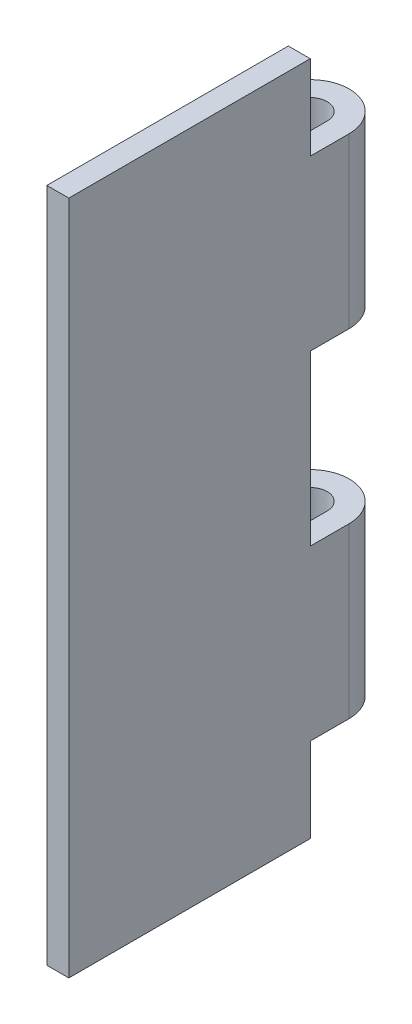
ISO-10303-21;
HEADER;
FILE_DESCRIPTION(('STEP AP214'),'2;1');
FILE_NAME('part.step','',(''),(''),'','','');
FILE_SCHEMA(('AUTOMOTIVE_DESIGN { 1 0 10303 214 1 1 1 1 }'));
ENDSEC;
DATA;
#1=APPLICATION_CONTEXT('core data for automotive mechanical design processes');
#2=APPLICATION_PROTOCOL_DEFINITION('international standard','automotive_design',2000,#1);
#3=PRODUCT_CONTEXT('',#1,'mechanical');
#4=PRODUCT('Part','Part','',(#3));
#5=PRODUCT_RELATED_PRODUCT_CATEGORY('part','',(#4));
#6=PRODUCT_DEFINITION_FORMATION('','',#4);
#7=PRODUCT_DEFINITION_CONTEXT('part definition',#1,'design');
#8=PRODUCT_DEFINITION('design','',#6,#7);
#9=PRODUCT_DEFINITION_SHAPE('','',#8);
#10=(LENGTH_UNIT() NAMED_UNIT(*) SI_UNIT(.MILLI.,.METRE.));
#11=(NAMED_UNIT(*) PLANE_ANGLE_UNIT() SI_UNIT($,.RADIAN.));
#12=(NAMED_UNIT(*) SI_UNIT($,.STERADIAN.) SOLID_ANGLE_UNIT());
#13=UNCERTAINTY_MEASURE_WITH_UNIT(LENGTH_MEASURE(1.E-05),#10,'distance_accuracy_value','');
#14=(GEOMETRIC_REPRESENTATION_CONTEXT(3) GLOBAL_UNCERTAINTY_ASSIGNED_CONTEXT((#13)) GLOBAL_UNIT_ASSIGNED_CONTEXT((#10,
#11,#12)) REPRESENTATION_CONTEXT('',''));
#15=CARTESIAN_POINT('',(0.,0.,0.));
#16=DIRECTION('',(0.,0.,1.));
#17=DIRECTION('',(1.,0.,0.));
#18=AXIS2_PLACEMENT_3D('',#15,#16,#17);
#19=CARTESIAN_POINT('',(-382.905,25.3999999999999,302.966610048912));
#20=DIRECTION('',(-0.937559071862946,0.,0.347826086956531));
#21=DIRECTION('',(0.347826086956531,0.,0.937559071862946));
#22=AXIS2_PLACEMENT_3D('',#19,#20,#21);
#23=PLANE('',#22);
#24=DIRECTION('',(0.,-1.,0.));
#25=VECTOR('',#24,1.);
#26=CARTESIAN_POINT('',(-383.479260869565,25.3999999999999,301.418700021266));
#27=LINE('',#26,#25);
#28=CARTESIAN_POINT('',(-383.479260869565,-19.0500000000001,301.418700021266));
#29=VERTEX_POINT('',#28);
#30=CARTESIAN_POINT('',(-383.479260869565,-6.35000000000014,301.418700021266));
#31=VERTEX_POINT('',#30);
#32=EDGE_CURVE('E237',#29,#31,#27,.F.);
#33=ORIENTED_EDGE('',*,*,#32,.T.);
#34=DIRECTION('',(0.347826086956531,0.,0.937559071862946));
#35=VECTOR('',#34,1.);
#36=CARTESIAN_POINT('',(-382.905,-6.35000000000016,302.966610048912));
#37=LINE('',#36,#35);
#38=CARTESIAN_POINT('',(-382.905,-6.35000000000013,302.966610048912));
#39=VERTEX_POINT('',#38);
#40=EDGE_CURVE('E242',#39,#31,#37,.F.);
#41=ORIENTED_EDGE('',*,*,#40,.F.);
#42=DIRECTION('',(0.,-1.,0.));
#43=VECTOR('',#42,1.);
#44=CARTESIAN_POINT('',(-382.905,25.3999999999999,302.966610048912));
#45=LINE('',#44,#43);
#46=CARTESIAN_POINT('',(-382.905,-19.0500000000001,302.966610048912));
#47=VERTEX_POINT('',#46);
#48=EDGE_CURVE('E125',#47,#39,#45,.F.);
#49=ORIENTED_EDGE('',*,*,#48,.F.);
#50=DIRECTION('',(-0.347826086956531,0.,-0.937559071862946));
#51=VECTOR('',#50,1.);
#52=CARTESIAN_POINT('',(-382.905,-19.0500000000001,302.966610048912));
#53=LINE('',#52,#51);
#54=EDGE_CURVE('E138',#47,#29,#53,.T.);
#55=ORIENTED_EDGE('',*,*,#54,.T.);
#56=EDGE_LOOP('',(#33,#41,#49,#55));
#57=FACE_BOUND('',#56,.T.);
#58=ADVANCED_FACE('F17',(#57),#23,.F.);
#59=CARTESIAN_POINT('',(-383.921,25.3999999999999,300.228));
#60=DIRECTION('',(0.,-1.,0.));
#61=DIRECTION('',(0.,0.,-1.));
#62=AXIS2_PLACEMENT_3D('',#59,#60,#61);
#63=CYLINDRICAL_SURFACE('',#62,2.92099999999998);
#64=CARTESIAN_POINT('',(-383.921,-6.35000000000009,300.228));
#65=DIRECTION('',(0.,-1.,0.));
#66=DIRECTION('',(0.,0.,-1.));
#67=AXIS2_PLACEMENT_3D('',#64,#65,#66);
#68=CIRCLE('',#67,2.92099999999998);
#69=CARTESIAN_POINT('',(-381.,-6.35000000000011,300.228));
#70=VERTEX_POINT('',#69);
#71=EDGE_CURVE('E144',#39,#70,#68,.T.);
#72=ORIENTED_EDGE('',*,*,#71,.T.);
#73=DIRECTION('',(0.,1.,0.));
#74=VECTOR('',#73,1.);
#75=CARTESIAN_POINT('',(-381.,25.3999999999999,300.228));
#76=LINE('',#75,#74);
#77=CARTESIAN_POINT('',(-381.,-19.0500000000001,300.228));
#78=VERTEX_POINT('',#77);
#79=EDGE_CURVE('E141',#70,#78,#76,.F.);
#80=ORIENTED_EDGE('',*,*,#79,.T.);
#81=CARTESIAN_POINT('',(-383.921,-19.05,300.228));
#82=DIRECTION('',(0.,-1.,0.));
#83=DIRECTION('',(0.,0.,-1.));
#84=AXIS2_PLACEMENT_3D('',#81,#82,#83);
#85=CIRCLE('',#84,2.92099999999998);
#86=EDGE_CURVE('E20',#78,#47,#85,.F.);
#87=ORIENTED_EDGE('',*,*,#86,.T.);
#88=ORIENTED_EDGE('',*,*,#48,.T.);
#89=EDGE_LOOP('',(#72,#80,#87,#88));
#90=FACE_BOUND('',#89,.T.);
#91=ADVANCED_FACE('F142',(#90),#63,.T.);
#92=CARTESIAN_POINT('',(-382.905,25.3999999999999,302.966610048912));
#93=DIRECTION('',(-0.937559071862946,0.,0.347826086956531));
#94=DIRECTION('',(0.347826086956531,0.,0.937559071862946));
#95=AXIS2_PLACEMENT_3D('',#92,#93,#94);
#96=PLANE('',#95);
#97=DIRECTION('',(0.,-1.,0.));
#98=VECTOR('',#97,1.);
#99=CARTESIAN_POINT('',(-382.905,25.3999999999999,302.966610048912));
#100=LINE('',#99,#98);
#101=CARTESIAN_POINT('',(-382.905,6.34999999999991,302.966610048912));
#102=VERTEX_POINT('',#101);
#103=CARTESIAN_POINT('',(-382.905,19.0499999999998,302.966610048912));
#104=VERTEX_POINT('',#103);
#105=EDGE_CURVE('E226',#102,#104,#100,.F.);
#106=ORIENTED_EDGE('',*,*,#105,.F.);
#107=DIRECTION('',(-0.347826086956531,0.,-0.937559071862946));
#108=VECTOR('',#107,1.);
#109=CARTESIAN_POINT('',(-382.905,6.34999999999991,302.966610048912));
#110=LINE('',#109,#108);
#111=CARTESIAN_POINT('',(-383.479260869565,6.34999999999991,301.418700021266));
#112=VERTEX_POINT('',#111);
#113=EDGE_CURVE('E252',#102,#112,#110,.T.);
#114=ORIENTED_EDGE('',*,*,#113,.T.);
#115=DIRECTION('',(0.,-1.,0.));
#116=VECTOR('',#115,1.);
#117=CARTESIAN_POINT('',(-383.479260869565,25.3999999999999,301.418700021266));
#118=LINE('',#117,#116);
#119=CARTESIAN_POINT('',(-383.479260869565,19.0499999999998,301.418700021266));
#120=VERTEX_POINT('',#119);
#121=EDGE_CURVE('E219',#112,#120,#118,.F.);
#122=ORIENTED_EDGE('',*,*,#121,.T.);
#123=DIRECTION('',(0.347826086956531,0.,0.937559071862946));
#124=VECTOR('',#123,1.);
#125=CARTESIAN_POINT('',(-382.905,19.0499999999998,302.966610048912));
#126=LINE('',#125,#124);
#127=EDGE_CURVE('E229',#104,#120,#126,.F.);
#128=ORIENTED_EDGE('',*,*,#127,.F.);
#129=EDGE_LOOP('',(#106,#114,#122,#128));
#130=FACE_BOUND('',#129,.T.);
#131=ADVANCED_FACE('F355',(#130),#96,.F.);
#132=CARTESIAN_POINT('',(-383.921,25.3999999999999,300.228));
#133=DIRECTION('',(0.,-1.,0.));
#134=DIRECTION('',(0.,0.,-1.));
#135=AXIS2_PLACEMENT_3D('',#132,#133,#134);
#136=CYLINDRICAL_SURFACE('',#135,2.92099999999998);
#137=CARTESIAN_POINT('',(-383.921,6.34999999999991,300.228));
#138=DIRECTION('',(0.,-1.,0.));
#139=DIRECTION('',(0.,0.,-1.));
#140=AXIS2_PLACEMENT_3D('',#137,#138,#139);
#141=CIRCLE('',#140,2.92099999999998);
#142=CARTESIAN_POINT('',(-381.,6.34999999999991,300.228));
#143=VERTEX_POINT('',#142);
#144=EDGE_CURVE('E253',#143,#102,#141,.F.);
#145=ORIENTED_EDGE('',*,*,#144,.T.);
#146=ORIENTED_EDGE('',*,*,#105,.T.);
#147=CARTESIAN_POINT('',(-383.921,19.0499999999998,300.228));
#148=DIRECTION('',(0.,-1.,0.));
#149=DIRECTION('',(0.,0.,-1.));
#150=AXIS2_PLACEMENT_3D('',#147,#148,#149);
#151=CIRCLE('',#150,2.92099999999998);
#152=CARTESIAN_POINT('',(-381.,19.0499999999998,300.228));
#153=VERTEX_POINT('',#152);
#154=EDGE_CURVE('E222',#104,#153,#151,.T.);
#155=ORIENTED_EDGE('',*,*,#154,.T.);
#156=DIRECTION('',(0.,1.,0.));
#157=VECTOR('',#156,1.);
#158=CARTESIAN_POINT('',(-381.,25.3999999999999,300.228));
#159=LINE('',#158,#157);
#160=EDGE_CURVE('E147',#153,#143,#159,.F.);
#161=ORIENTED_EDGE('',*,*,#160,.T.);
#162=EDGE_LOOP('',(#145,#146,#155,#161));
#163=FACE_BOUND('',#162,.T.);
#164=ADVANCED_FACE('F394',(#163),#136,.T.);
#165=CARTESIAN_POINT('',(-381.,25.3999999999999,321.31));
#166=DIRECTION('',(-1.,0.,0.));
#167=DIRECTION('',(0.,0.,1.));
#168=AXIS2_PLACEMENT_3D('',#165,#166,#167);
#169=PLANE('',#168);
#170=DIRECTION('',(0.,0.,1.));
#171=VECTOR('',#170,1.);
#172=CARTESIAN_POINT('',(-381.,-19.0500000000001,297.307));
#173=LINE('',#172,#171);
#174=CARTESIAN_POINT('',(-381.,-19.0500000000001,303.149));
#175=VERTEX_POINT('',#174);
#176=EDGE_CURVE('E135',#175,#78,#173,.F.);
#177=ORIENTED_EDGE('',*,*,#176,.T.);
#178=ORIENTED_EDGE('',*,*,#79,.F.);
#179=DIRECTION('',(0.,0.,-1.));
#180=VECTOR('',#179,1.);
#181=CARTESIAN_POINT('',(-381.,-6.35000000000013,297.307));
#182=LINE('',#181,#180);
#183=CARTESIAN_POINT('',(-381.,-6.35000000000013,303.149));
#184=VERTEX_POINT('',#183);
#185=EDGE_CURVE('E260',#70,#184,#182,.F.);
#186=ORIENTED_EDGE('',*,*,#185,.T.);
#187=DIRECTION('',(0.,1.,0.));
#188=VECTOR('',#187,1.);
#189=CARTESIAN_POINT('',(-381.,6.34999999999991,303.149));
#190=LINE('',#189,#188);
#191=CARTESIAN_POINT('',(-381.,6.34999999999991,303.149));
#192=VERTEX_POINT('',#191);
#193=EDGE_CURVE('E231',#184,#192,#190,.T.);
#194=ORIENTED_EDGE('',*,*,#193,.T.);
#195=DIRECTION('',(0.,0.,1.));
#196=VECTOR('',#195,1.);
#197=CARTESIAN_POINT('',(-381.,6.34999999999991,297.307));
#198=LINE('',#197,#196);
#199=EDGE_CURVE('E256',#192,#143,#198,.F.);
#200=ORIENTED_EDGE('',*,*,#199,.T.);
#201=ORIENTED_EDGE('',*,*,#160,.F.);
#202=DIRECTION('',(0.,0.,-1.));
#203=VECTOR('',#202,1.);
#204=CARTESIAN_POINT('',(-381.,19.0499999999998,297.307));
#205=LINE('',#204,#203);
#206=CARTESIAN_POINT('',(-381.,19.0499999999998,303.149));
#207=VERTEX_POINT('',#206);
#208=EDGE_CURVE('E247',#153,#207,#205,.F.);
#209=ORIENTED_EDGE('',*,*,#208,.T.);
#210=DIRECTION('',(0.,1.,0.));
#211=VECTOR('',#210,1.);
#212=CARTESIAN_POINT('',(-381.,31.7499999999999,303.149));
#213=LINE('',#212,#211);
#214=CARTESIAN_POINT('',(-381.,25.3999999999999,303.149));
#215=VERTEX_POINT('',#214);
#216=EDGE_CURVE('E202',#207,#215,#213,.T.);
#217=ORIENTED_EDGE('',*,*,#216,.T.);
#218=DIRECTION('',(0.,0.,1.));
#219=VECTOR('',#218,1.);
#220=CARTESIAN_POINT('',(-381.,25.3999999999999,300.228));
#221=LINE('',#220,#219);
#222=CARTESIAN_POINT('',(-381.,25.3999999999999,321.31));
#223=VERTEX_POINT('',#222);
#224=EDGE_CURVE('E200',#223,#215,#221,.F.);
#225=ORIENTED_EDGE('',*,*,#224,.F.);
#226=DIRECTION('',(0.,1.,0.));
#227=VECTOR('',#226,1.);
#228=CARTESIAN_POINT('',(-381.,25.3999999999999,321.31));
#229=LINE('',#228,#227);
#230=CARTESIAN_POINT('',(-381.,-25.4000000000001,321.31));
#231=VERTEX_POINT('',#230);
#232=EDGE_CURVE('E183',#223,#231,#229,.F.);
#233=ORIENTED_EDGE('',*,*,#232,.T.);
#234=DIRECTION('',(0.,0.,1.));
#235=VECTOR('',#234,1.);
#236=CARTESIAN_POINT('',(-381.,-25.4000000000001,300.228));
#237=LINE('',#236,#235);
#238=CARTESIAN_POINT('',(-381.,-25.4000000000001,303.149));
#239=VERTEX_POINT('',#238);
#240=EDGE_CURVE('E169',#231,#239,#237,.F.);
#241=ORIENTED_EDGE('',*,*,#240,.T.);
#242=DIRECTION('',(0.,1.,0.));
#243=VECTOR('',#242,1.);
#244=CARTESIAN_POINT('',(-381.,-19.0500000000001,303.149));
#245=LINE('',#244,#243);
#246=EDGE_CURVE('E151',#239,#175,#245,.T.);
#247=ORIENTED_EDGE('',*,*,#246,.T.);
#248=EDGE_LOOP('',(#177,#178,#186,#194,#200,#201,#209,#217,#225,#233,#241,#247));
#249=FACE_BOUND('',#248,.T.);
#250=ADVANCED_FACE('F150',(#249),#169,.F.);
#251=CARTESIAN_POINT('',(-386.842,-19.0500000000001,297.307));
#252=DIRECTION('',(0.,1.,0.));
#253=DIRECTION('',(0.,0.,1.));
#254=AXIS2_PLACEMENT_3D('',#251,#252,#253);
#255=PLANE('',#254);
#256=DIRECTION('',(0.,0.,-1.));
#257=VECTOR('',#256,1.);
#258=CARTESIAN_POINT('',(-382.651,-19.0500000000001,300.228));
#259=LINE('',#258,#257);
#260=CARTESIAN_POINT('',(-382.651,-19.0500000000001,303.149));
#261=VERTEX_POINT('',#260);
#262=CARTESIAN_POINT('',(-382.651,-19.0500000000001,300.228));
#263=VERTEX_POINT('',#262);
#264=EDGE_CURVE('E160',#261,#263,#259,.T.);
#265=ORIENTED_EDGE('',*,*,#264,.T.);
#266=CARTESIAN_POINT('',(-383.921,-19.0500000000001,300.228));
#267=DIRECTION('',(0.,-1.,0.));
#268=DIRECTION('',(0.,0.,-1.));
#269=AXIS2_PLACEMENT_3D('',#266,#267,#268);
#270=CIRCLE('',#269,1.26999999999996);
#271=EDGE_CURVE('E239',#263,#29,#270,.F.);
#272=ORIENTED_EDGE('',*,*,#271,.T.);
#273=ORIENTED_EDGE('',*,*,#54,.F.);
#274=ORIENTED_EDGE('',*,*,#86,.F.);
#275=ORIENTED_EDGE('',*,*,#176,.F.);
#276=DIRECTION('',(1.,0.,0.));
#277=VECTOR('',#276,1.);
#278=CARTESIAN_POINT('',(-386.842,-19.0500000000001,303.149));
#279=LINE('',#278,#277);
#280=EDGE_CURVE('E158',#175,#261,#279,.F.);
#281=ORIENTED_EDGE('',*,*,#280,.T.);
#282=EDGE_LOOP('',(#265,#272,#273,#274,#275,#281));
#283=FACE_BOUND('',#282,.T.);
#284=ADVANCED_FACE('F132',(#283),#255,.F.);
#285=CARTESIAN_POINT('',(-383.921,25.3999999999999,300.228));
#286=DIRECTION('',(0.,-1.,0.));
#287=DIRECTION('',(0.,0.,-1.));
#288=AXIS2_PLACEMENT_3D('',#285,#286,#287);
#289=CYLINDRICAL_SURFACE('',#288,1.26999999999996);
#290=ORIENTED_EDGE('',*,*,#271,.F.);
#291=DIRECTION('',(0.,1.,0.));
#292=VECTOR('',#291,1.);
#293=CARTESIAN_POINT('',(-382.651,25.3999999999999,300.228));
#294=LINE('',#293,#292);
#295=CARTESIAN_POINT('',(-382.651,-6.35000000000013,300.228));
#296=VERTEX_POINT('',#295);
#297=EDGE_CURVE('E266',#263,#296,#294,.T.);
#298=ORIENTED_EDGE('',*,*,#297,.T.);
#299=CARTESIAN_POINT('',(-383.921,-6.35000000000013,300.228));
#300=DIRECTION('',(0.,-1.,0.));
#301=DIRECTION('',(0.,0.,-1.));
#302=AXIS2_PLACEMENT_3D('',#299,#300,#301);
#303=CIRCLE('',#302,1.26999999999996);
#304=EDGE_CURVE('E257',#296,#31,#303,.F.);
#305=ORIENTED_EDGE('',*,*,#304,.T.);
#306=ORIENTED_EDGE('',*,*,#32,.F.);
#307=EDGE_LOOP('',(#290,#298,#305,#306));
#308=FACE_BOUND('',#307,.T.);
#309=ADVANCED_FACE('F265',(#308),#289,.F.);
#310=CARTESIAN_POINT('',(-386.842,-6.35000000000013,297.307));
#311=DIRECTION('',(0.,-1.,0.));
#312=DIRECTION('',(0.,0.,-1.));
#313=AXIS2_PLACEMENT_3D('',#310,#311,#312);
#314=PLANE('',#313);
#315=ORIENTED_EDGE('',*,*,#304,.F.);
#316=DIRECTION('',(0.,0.,-1.));
#317=VECTOR('',#316,1.);
#318=CARTESIAN_POINT('',(-382.651,-6.35000000000013,300.228));
#319=LINE('',#318,#317);
#320=CARTESIAN_POINT('',(-382.651,-6.35000000000013,303.149));
#321=VERTEX_POINT('',#320);
#322=EDGE_CURVE('E273',#296,#321,#319,.F.);
#323=ORIENTED_EDGE('',*,*,#322,.T.);
#324=DIRECTION('',(1.,0.,0.));
#325=VECTOR('',#324,1.);
#326=CARTESIAN_POINT('',(-386.842,-6.35000000000013,303.149));
#327=LINE('',#326,#325);
#328=EDGE_CURVE('E234',#321,#184,#327,.T.);
#329=ORIENTED_EDGE('',*,*,#328,.T.);
#330=ORIENTED_EDGE('',*,*,#185,.F.);
#331=ORIENTED_EDGE('',*,*,#71,.F.);
#332=ORIENTED_EDGE('',*,*,#40,.T.);
#333=EDGE_LOOP('',(#315,#323,#329,#330,#331,#332));
#334=FACE_BOUND('',#333,.T.);
#335=ADVANCED_FACE('F349',(#334),#314,.F.);
#336=CARTESIAN_POINT('',(-386.842,6.34999999999991,303.149));
#337=DIRECTION('',(0.,0.,1.));
#338=DIRECTION('',(1.,0.,0.));
#339=AXIS2_PLACEMENT_3D('',#336,#337,#338);
#340=PLANE('',#339);
#341=DIRECTION('',(1.,0.,0.));
#342=VECTOR('',#341,1.);
#343=CARTESIAN_POINT('',(-386.842,6.34999999999991,303.149));
#344=LINE('',#343,#342);
#345=CARTESIAN_POINT('',(-382.651,6.34999999999991,303.149));
#346=VERTEX_POINT('',#345);
#347=EDGE_CURVE('E233',#346,#192,#344,.T.);
#348=ORIENTED_EDGE('',*,*,#347,.T.);
#349=ORIENTED_EDGE('',*,*,#193,.F.);
#350=ORIENTED_EDGE('',*,*,#328,.F.);
#351=DIRECTION('',(0.,1.,0.));
#352=VECTOR('',#351,1.);
#353=CARTESIAN_POINT('',(-382.651,25.3999999999999,303.149));
#354=LINE('',#353,#352);
#355=EDGE_CURVE('E275',#321,#346,#354,.T.);
#356=ORIENTED_EDGE('',*,*,#355,.T.);
#357=EDGE_LOOP('',(#348,#349,#350,#356));
#358=FACE_BOUND('',#357,.T.);
#359=ADVANCED_FACE('F346',(#358),#340,.F.);
#360=CARTESIAN_POINT('',(-386.842,6.34999999999991,297.307));
#361=DIRECTION('',(0.,1.,0.));
#362=DIRECTION('',(0.,0.,1.));
#363=AXIS2_PLACEMENT_3D('',#360,#361,#362);
#364=PLANE('',#363);
#365=DIRECTION('',(0.,0.,-1.));
#366=VECTOR('',#365,1.);
#367=CARTESIAN_POINT('',(-382.651,6.34999999999991,300.228));
#368=LINE('',#367,#366);
#369=CARTESIAN_POINT('',(-382.651,6.34999999999991,300.228));
#370=VERTEX_POINT('',#369);
#371=EDGE_CURVE('E293',#346,#370,#368,.T.);
#372=ORIENTED_EDGE('',*,*,#371,.T.);
#373=CARTESIAN_POINT('',(-383.921,6.34999999999991,300.228));
#374=DIRECTION('',(0.,-1.,0.));
#375=DIRECTION('',(0.,0.,-1.));
#376=AXIS2_PLACEMENT_3D('',#373,#374,#375);
#377=CIRCLE('',#376,1.26999999999996);
#378=EDGE_CURVE('E223',#370,#112,#377,.F.);
#379=ORIENTED_EDGE('',*,*,#378,.T.);
#380=ORIENTED_EDGE('',*,*,#113,.F.);
#381=ORIENTED_EDGE('',*,*,#144,.F.);
#382=ORIENTED_EDGE('',*,*,#199,.F.);
#383=ORIENTED_EDGE('',*,*,#347,.F.);
#384=EDGE_LOOP('',(#372,#379,#380,#381,#382,#383));
#385=FACE_BOUND('',#384,.T.);
#386=ADVANCED_FACE('F343',(#385),#364,.F.);
#387=CARTESIAN_POINT('',(-383.921,25.3999999999999,300.228));
#388=DIRECTION('',(0.,-1.,0.));
#389=DIRECTION('',(0.,0.,-1.));
#390=AXIS2_PLACEMENT_3D('',#387,#388,#389);
#391=CYLINDRICAL_SURFACE('',#390,1.26999999999996);
#392=ORIENTED_EDGE('',*,*,#121,.F.);
#393=ORIENTED_EDGE('',*,*,#378,.F.);
#394=DIRECTION('',(0.,1.,0.));
#395=VECTOR('',#394,1.);
#396=CARTESIAN_POINT('',(-382.651,25.3999999999999,300.228));
#397=LINE('',#396,#395);
#398=CARTESIAN_POINT('',(-382.651,19.0499999999998,300.228));
#399=VERTEX_POINT('',#398);
#400=EDGE_CURVE('E307',#370,#399,#397,.T.);
#401=ORIENTED_EDGE('',*,*,#400,.T.);
#402=CARTESIAN_POINT('',(-383.921,19.0499999999998,300.228));
#403=DIRECTION('',(0.,-1.,0.));
#404=DIRECTION('',(0.,0.,-1.));
#405=AXIS2_PLACEMENT_3D('',#402,#403,#404);
#406=CIRCLE('',#405,1.26999999999996);
#407=EDGE_CURVE('E244',#399,#120,#406,.F.);
#408=ORIENTED_EDGE('',*,*,#407,.T.);
#409=EDGE_LOOP('',(#392,#393,#401,#408));
#410=FACE_BOUND('',#409,.T.);
#411=ADVANCED_FACE('F340',(#410),#391,.F.);
#412=CARTESIAN_POINT('',(-386.842,19.0499999999998,297.307));
#413=DIRECTION('',(0.,-1.,0.));
#414=DIRECTION('',(0.,0.,-1.));
#415=AXIS2_PLACEMENT_3D('',#412,#413,#414);
#416=PLANE('',#415);
#417=ORIENTED_EDGE('',*,*,#407,.F.);
#418=DIRECTION('',(0.,0.,-1.));
#419=VECTOR('',#418,1.);
#420=CARTESIAN_POINT('',(-382.651,19.0499999999998,300.228));
#421=LINE('',#420,#419);
#422=CARTESIAN_POINT('',(-382.651,19.0499999999998,303.149));
#423=VERTEX_POINT('',#422);
#424=EDGE_CURVE('E316',#399,#423,#421,.F.);
#425=ORIENTED_EDGE('',*,*,#424,.T.);
#426=DIRECTION('',(1.,0.,0.));
#427=VECTOR('',#426,1.);
#428=CARTESIAN_POINT('',(-386.842,19.0499999999998,303.149));
#429=LINE('',#428,#427);
#430=EDGE_CURVE('E212',#423,#207,#429,.T.);
#431=ORIENTED_EDGE('',*,*,#430,.T.);
#432=ORIENTED_EDGE('',*,*,#208,.F.);
#433=ORIENTED_EDGE('',*,*,#154,.F.);
#434=ORIENTED_EDGE('',*,*,#127,.T.);
#435=EDGE_LOOP('',(#417,#425,#431,#432,#433,#434));
#436=FACE_BOUND('',#435,.T.);
#437=ADVANCED_FACE('F333',(#436),#416,.F.);
#438=CARTESIAN_POINT('',(-386.842,31.7499999999999,303.149));
#439=DIRECTION('',(0.,0.,1.));
#440=DIRECTION('',(1.,0.,0.));
#441=AXIS2_PLACEMENT_3D('',#438,#439,#440);
#442=PLANE('',#441);
#443=DIRECTION('',(1.,0.,0.));
#444=VECTOR('',#443,1.);
#445=CARTESIAN_POINT('',(-383.921,25.3999999999999,303.149));
#446=LINE('',#445,#444);
#447=CARTESIAN_POINT('',(-382.651,25.3999999999999,303.149));
#448=VERTEX_POINT('',#447);
#449=EDGE_CURVE('E197',#215,#448,#446,.F.);
#450=ORIENTED_EDGE('',*,*,#449,.F.);
#451=ORIENTED_EDGE('',*,*,#216,.F.);
#452=ORIENTED_EDGE('',*,*,#430,.F.);
#453=DIRECTION('',(0.,1.,0.));
#454=VECTOR('',#453,1.);
#455=CARTESIAN_POINT('',(-382.651,25.3999999999999,303.149));
#456=LINE('',#455,#454);
#457=EDGE_CURVE('E207',#423,#448,#456,.T.);
#458=ORIENTED_EDGE('',*,*,#457,.T.);
#459=EDGE_LOOP('',(#450,#451,#452,#458));
#460=FACE_BOUND('',#459,.T.);
#461=ADVANCED_FACE('F331',(#460),#442,.F.);
#462=CARTESIAN_POINT('',(-383.921,25.3999999999999,300.228));
#463=DIRECTION('',(0.,1.,0.));
#464=DIRECTION('',(0.,0.,1.));
#465=AXIS2_PLACEMENT_3D('',#462,#463,#464);
#466=PLANE('',#465);
#467=ORIENTED_EDGE('',*,*,#224,.T.);
#468=ORIENTED_EDGE('',*,*,#449,.T.);
#469=DIRECTION('',(0.,0.,-1.));
#470=VECTOR('',#469,1.);
#471=CARTESIAN_POINT('',(-382.651,25.3999999999999,300.228));
#472=LINE('',#471,#470);
#473=CARTESIAN_POINT('',(-382.651,25.3999999999999,321.31));
#474=VERTEX_POINT('',#473);
#475=EDGE_CURVE('E192',#448,#474,#472,.F.);
#476=ORIENTED_EDGE('',*,*,#475,.T.);
#477=DIRECTION('',(-1.,0.,0.));
#478=VECTOR('',#477,1.);
#479=CARTESIAN_POINT('',(-382.651,25.3999999999999,321.31));
#480=LINE('',#479,#478);
#481=EDGE_CURVE('E187',#474,#223,#480,.F.);
#482=ORIENTED_EDGE('',*,*,#481,.T.);
#483=EDGE_LOOP('',(#467,#468,#476,#482));
#484=FACE_BOUND('',#483,.T.);
#485=ADVANCED_FACE('F371',(#484),#466,.T.);
#486=CARTESIAN_POINT('',(-382.651,25.3999999999999,321.31));
#487=DIRECTION('',(0.,0.,-1.));
#488=DIRECTION('',(-1.,0.,0.));
#489=AXIS2_PLACEMENT_3D('',#486,#487,#488);
#490=PLANE('',#489);
#491=ORIENTED_EDGE('',*,*,#481,.F.);
#492=DIRECTION('',(0.,1.,0.));
#493=VECTOR('',#492,1.);
#494=CARTESIAN_POINT('',(-382.651,25.3999999999999,321.31));
#495=LINE('',#494,#493);
#496=CARTESIAN_POINT('',(-382.651,-25.4000000000001,321.31));
#497=VERTEX_POINT('',#496);
#498=EDGE_CURVE('E178',#474,#497,#495,.F.);
#499=ORIENTED_EDGE('',*,*,#498,.T.);
#500=DIRECTION('',(1.,0.,0.));
#501=VECTOR('',#500,1.);
#502=CARTESIAN_POINT('',(-383.921,-25.4000000000001,321.31));
#503=LINE('',#502,#501);
#504=EDGE_CURVE('E173',#497,#231,#503,.T.);
#505=ORIENTED_EDGE('',*,*,#504,.T.);
#506=ORIENTED_EDGE('',*,*,#232,.F.);
#507=EDGE_LOOP('',(#491,#499,#505,#506));
#508=FACE_BOUND('',#507,.T.);
#509=ADVANCED_FACE('F367',(#508),#490,.F.);
#510=CARTESIAN_POINT('',(-383.921,-25.4000000000001,300.228));
#511=DIRECTION('',(0.,1.,0.));
#512=DIRECTION('',(0.,0.,1.));
#513=AXIS2_PLACEMENT_3D('',#510,#511,#512);
#514=PLANE('',#513);
#515=ORIENTED_EDGE('',*,*,#240,.F.);
#516=ORIENTED_EDGE('',*,*,#504,.F.);
#517=DIRECTION('',(0.,0.,-1.));
#518=VECTOR('',#517,1.);
#519=CARTESIAN_POINT('',(-382.651,-25.4000000000001,300.228));
#520=LINE('',#519,#518);
#521=CARTESIAN_POINT('',(-382.651,-25.4000000000001,303.149));
#522=VERTEX_POINT('',#521);
#523=EDGE_CURVE('E26',#497,#522,#520,.T.);
#524=ORIENTED_EDGE('',*,*,#523,.T.);
#525=DIRECTION('',(1.,0.,0.));
#526=VECTOR('',#525,1.);
#527=CARTESIAN_POINT('',(-386.842,-25.4000000000001,303.149));
#528=LINE('',#527,#526);
#529=EDGE_CURVE('E34',#522,#239,#528,.T.);
#530=ORIENTED_EDGE('',*,*,#529,.T.);
#531=EDGE_LOOP('',(#515,#516,#524,#530));
#532=FACE_BOUND('',#531,.T.);
#533=ADVANCED_FACE('F362',(#532),#514,.F.);
#534=CARTESIAN_POINT('',(-386.842,-19.0500000000001,303.149));
#535=DIRECTION('',(0.,0.,1.));
#536=DIRECTION('',(1.,0.,0.));
#537=AXIS2_PLACEMENT_3D('',#534,#535,#536);
#538=PLANE('',#537);
#539=ORIENTED_EDGE('',*,*,#280,.F.);
#540=ORIENTED_EDGE('',*,*,#246,.F.);
#541=ORIENTED_EDGE('',*,*,#529,.F.);
#542=DIRECTION('',(0.,1.,0.));
#543=VECTOR('',#542,1.);
#544=CARTESIAN_POINT('',(-382.651,25.3999999999999,303.149));
#545=LINE('',#544,#543);
#546=EDGE_CURVE('E11',#522,#261,#545,.T.);
#547=ORIENTED_EDGE('',*,*,#546,.T.);
#548=EDGE_LOOP('',(#539,#540,#541,#547));
#549=FACE_BOUND('',#548,.T.);
#550=ADVANCED_FACE('F357',(#549),#538,.F.);
#551=CARTESIAN_POINT('',(-382.651,25.3999999999999,300.228));
#552=DIRECTION('',(1.,0.,0.));
#553=DIRECTION('',(0.,0.,-1.));
#554=AXIS2_PLACEMENT_3D('',#551,#552,#553);
#555=PLANE('',#554);
#556=ORIENTED_EDGE('',*,*,#523,.F.);
#557=ORIENTED_EDGE('',*,*,#498,.F.);
#558=ORIENTED_EDGE('',*,*,#475,.F.);
#559=ORIENTED_EDGE('',*,*,#457,.F.);
#560=ORIENTED_EDGE('',*,*,#424,.F.);
#561=ORIENTED_EDGE('',*,*,#400,.F.);
#562=ORIENTED_EDGE('',*,*,#371,.F.);
#563=ORIENTED_EDGE('',*,*,#355,.F.);
#564=ORIENTED_EDGE('',*,*,#322,.F.);
#565=ORIENTED_EDGE('',*,*,#297,.F.);
#566=ORIENTED_EDGE('',*,*,#264,.F.);
#567=ORIENTED_EDGE('',*,*,#546,.F.);
#568=EDGE_LOOP('',(#556,#557,#558,#559,#560,#561,#562,#563,#564,#565,#566,#567));
#569=FACE_BOUND('',#568,.T.);
#570=ADVANCED_FACE('F270',(#569),#555,.F.);
#571=CLOSED_SHELL('',(#58,#91,#131,#164,#250,#284,#309,#335,#359,#386,#411,#437,#461,#485,#509,
#533,#550,#570));
#572=MANIFOLD_SOLID_BREP('B1',#571);
#573=ADVANCED_BREP_SHAPE_REPRESENTATION('',(#18,#572),#14);
#574=SHAPE_DEFINITION_REPRESENTATION(#9,#573);
ENDSEC;
END-ISO-10303-21;
